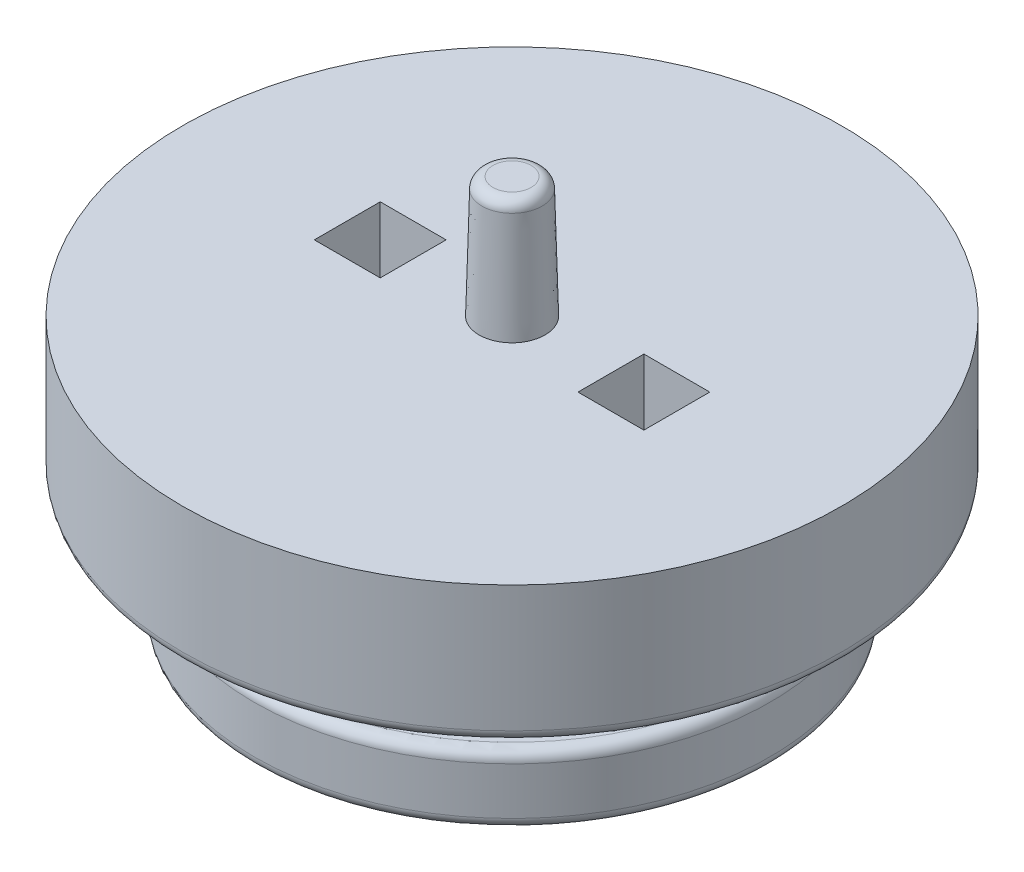
ISO-10303-21;
HEADER;
FILE_DESCRIPTION(('STEP AP214'),'2;1');
FILE_NAME('part.step','',(''),(''),'','','');
FILE_SCHEMA(('AUTOMOTIVE_DESIGN { 1 0 10303 214 1 1 1 1 }'));
ENDSEC;
DATA;
#1=APPLICATION_CONTEXT('core data for automotive mechanical design processes');
#2=APPLICATION_PROTOCOL_DEFINITION('international standard','automotive_design',2000,#1);
#3=PRODUCT_CONTEXT('',#1,'mechanical');
#4=PRODUCT('Part','Part','',(#3));
#5=PRODUCT_RELATED_PRODUCT_CATEGORY('part','',(#4));
#6=PRODUCT_DEFINITION_FORMATION('','',#4);
#7=PRODUCT_DEFINITION_CONTEXT('part definition',#1,'design');
#8=PRODUCT_DEFINITION('design','',#6,#7);
#9=PRODUCT_DEFINITION_SHAPE('','',#8);
#10=(LENGTH_UNIT() NAMED_UNIT(*) SI_UNIT(.MILLI.,.METRE.));
#11=(NAMED_UNIT(*) PLANE_ANGLE_UNIT() SI_UNIT($,.RADIAN.));
#12=(NAMED_UNIT(*) SI_UNIT($,.STERADIAN.) SOLID_ANGLE_UNIT());
#13=UNCERTAINTY_MEASURE_WITH_UNIT(LENGTH_MEASURE(1.E-05),#10,'distance_accuracy_value','');
#14=(GEOMETRIC_REPRESENTATION_CONTEXT(3) GLOBAL_UNCERTAINTY_ASSIGNED_CONTEXT((#13)) GLOBAL_UNIT_ASSIGNED_CONTEXT((#10,
#11,#12)) REPRESENTATION_CONTEXT('',''));
#15=CARTESIAN_POINT('',(0.,0.,0.));
#16=DIRECTION('',(0.,0.,1.));
#17=DIRECTION('',(1.,0.,0.));
#18=AXIS2_PLACEMENT_3D('',#15,#16,#17);
#19=CARTESIAN_POINT('',(0.,17.,0.));
#20=DIRECTION('',(0.,1.,0.));
#21=DIRECTION('',(0.,0.,1.));
#22=AXIS2_PLACEMENT_3D('',#19,#20,#21);
#23=PLANE('',#22);
#24=DIRECTION('',(0.,0.,-1.));
#25=VECTOR('',#24,1.);
#26=CARTESIAN_POINT('',(-4.5,17.,-1.5));
#27=LINE('',#26,#25);
#28=CARTESIAN_POINT('',(-4.5,17.,1.5));
#29=VERTEX_POINT('',#28);
#30=CARTESIAN_POINT('',(-4.5,17.,-1.5));
#31=VERTEX_POINT('',#30);
#32=EDGE_CURVE('E151',#29,#31,#27,.T.);
#33=ORIENTED_EDGE('',*,*,#32,.T.);
#34=DIRECTION('',(-1.,0.,0.));
#35=VECTOR('',#34,1.);
#36=CARTESIAN_POINT('',(-7.5,17.,-1.5));
#37=LINE('',#36,#35);
#38=CARTESIAN_POINT('',(-7.5,17.,-1.5));
#39=VERTEX_POINT('',#38);
#40=EDGE_CURVE('E169',#31,#39,#37,.T.);
#41=ORIENTED_EDGE('',*,*,#40,.T.);
#42=DIRECTION('',(0.,0.,1.));
#43=VECTOR('',#42,1.);
#44=CARTESIAN_POINT('',(-7.5,17.,-1.5));
#45=LINE('',#44,#43);
#46=CARTESIAN_POINT('',(-7.5,17.,1.5));
#47=VERTEX_POINT('',#46);
#48=EDGE_CURVE('E156',#39,#47,#45,.T.);
#49=ORIENTED_EDGE('',*,*,#48,.T.);
#50=DIRECTION('',(1.,0.,0.));
#51=VECTOR('',#50,1.);
#52=CARTESIAN_POINT('',(-7.5,17.,1.5));
#53=LINE('',#52,#51);
#54=EDGE_CURVE('E176',#47,#29,#53,.T.);
#55=ORIENTED_EDGE('',*,*,#54,.T.);
#56=EDGE_LOOP('',(#33,#41,#49,#55));
#57=FACE_BOUND('',#56,.T.);
#58=ADVANCED_FACE('F44',(#57),#23,.T.);
#59=DIRECTION('',(0.,0.,1.));
#60=VECTOR('',#59,1.);
#61=CARTESIAN_POINT('',(4.5,17.,-1.5));
#62=LINE('',#61,#60);
#63=CARTESIAN_POINT('',(4.5,17.,-1.5));
#64=VERTEX_POINT('',#63);
#65=CARTESIAN_POINT('',(4.5,17.,1.5));
#66=VERTEX_POINT('',#65);
#67=EDGE_CURVE('E128',#64,#66,#62,.T.);
#68=ORIENTED_EDGE('',*,*,#67,.T.);
#69=DIRECTION('',(1.,0.,0.));
#70=VECTOR('',#69,1.);
#71=CARTESIAN_POINT('',(4.5,17.,1.5));
#72=LINE('',#71,#70);
#73=CARTESIAN_POINT('',(7.5,17.,1.5));
#74=VERTEX_POINT('',#73);
#75=EDGE_CURVE('E112',#66,#74,#72,.T.);
#76=ORIENTED_EDGE('',*,*,#75,.T.);
#77=DIRECTION('',(0.,0.,-1.));
#78=VECTOR('',#77,1.);
#79=CARTESIAN_POINT('',(7.5,17.,-1.5));
#80=LINE('',#79,#78);
#81=CARTESIAN_POINT('',(7.5,17.,-1.5));
#82=VERTEX_POINT('',#81);
#83=EDGE_CURVE('E121',#74,#82,#80,.T.);
#84=ORIENTED_EDGE('',*,*,#83,.T.);
#85=DIRECTION('',(-1.,0.,0.));
#86=VECTOR('',#85,1.);
#87=CARTESIAN_POINT('',(4.5,17.,-1.5));
#88=LINE('',#87,#86);
#89=EDGE_CURVE('E181',#82,#64,#88,.T.);
#90=ORIENTED_EDGE('',*,*,#89,.T.);
#91=EDGE_LOOP('',(#68,#76,#84,#90));
#92=FACE_BOUND('',#91,.T.);
#93=ADVANCED_FACE('F132',(#92),#23,.T.);
#94=CARTESIAN_POINT('',(0.,21.25,0.));
#95=DIRECTION('',(0.,1.,0.));
#96=DIRECTION('',(0.,0.,1.));
#97=AXIS2_PLACEMENT_3D('',#94,#95,#96);
#98=PLANE('',#97);
#99=CARTESIAN_POINT('',(0.,21.25,0.));
#100=DIRECTION('',(0.,1.,0.));
#101=DIRECTION('',(0.,0.,1.));
#102=AXIS2_PLACEMENT_3D('',#99,#100,#101);
#103=CIRCLE('',#102,1.5);
#104=CARTESIAN_POINT('',(0.,21.25,1.5));
#105=VERTEX_POINT('',#104);
#106=EDGE_CURVE('E129',#105,#105,#103,.T.);
#107=ORIENTED_EDGE('',*,*,#106,.F.);
#108=EDGE_LOOP('',(#107));
#109=FACE_BOUND('',#108,.T.);
#110=CARTESIAN_POINT('',(0.,21.25,0.));
#111=DIRECTION('',(0.,1.,0.));
#112=DIRECTION('',(0.,0.,1.));
#113=AXIS2_PLACEMENT_3D('',#110,#111,#112);
#114=CIRCLE('',#113,15.);
#115=CARTESIAN_POINT('',(0.,21.25,15.));
#116=VERTEX_POINT('',#115);
#117=EDGE_CURVE('E194',#116,#116,#114,.T.);
#118=ORIENTED_EDGE('',*,*,#117,.T.);
#119=EDGE_LOOP('',(#118));
#120=FACE_BOUND('',#119,.T.);
#121=DIRECTION('',(-1.,0.,0.));
#122=VECTOR('',#121,1.);
#123=CARTESIAN_POINT('',(-7.5,21.25,-1.5));
#124=LINE('',#123,#122);
#125=CARTESIAN_POINT('',(-4.5,21.25,-1.5));
#126=VERTEX_POINT('',#125);
#127=CARTESIAN_POINT('',(-7.5,21.25,-1.5));
#128=VERTEX_POINT('',#127);
#129=EDGE_CURVE('E155',#126,#128,#124,.T.);
#130=ORIENTED_EDGE('',*,*,#129,.F.);
#131=DIRECTION('',(0.,0.,-1.));
#132=VECTOR('',#131,1.);
#133=CARTESIAN_POINT('',(-4.5,21.25,-1.5));
#134=LINE('',#133,#132);
#135=CARTESIAN_POINT('',(-4.5,21.25,1.5));
#136=VERTEX_POINT('',#135);
#137=EDGE_CURVE('E152',#136,#126,#134,.T.);
#138=ORIENTED_EDGE('',*,*,#137,.F.);
#139=DIRECTION('',(1.,0.,0.));
#140=VECTOR('',#139,1.);
#141=CARTESIAN_POINT('',(-7.5,21.25,1.5));
#142=LINE('',#141,#140);
#143=CARTESIAN_POINT('',(-7.5,21.25,1.5));
#144=VERTEX_POINT('',#143);
#145=EDGE_CURVE('E162',#144,#136,#142,.T.);
#146=ORIENTED_EDGE('',*,*,#145,.F.);
#147=DIRECTION('',(0.,0.,1.));
#148=VECTOR('',#147,1.);
#149=CARTESIAN_POINT('',(-7.5,21.25,-1.5));
#150=LINE('',#149,#148);
#151=EDGE_CURVE('E159',#128,#144,#150,.T.);
#152=ORIENTED_EDGE('',*,*,#151,.F.);
#153=EDGE_LOOP('',(#130,#138,#146,#152));
#154=FACE_BOUND('',#153,.T.);
#155=DIRECTION('',(-1.,0.,0.));
#156=VECTOR('',#155,1.);
#157=CARTESIAN_POINT('',(4.5,21.25,-1.5));
#158=LINE('',#157,#156);
#159=CARTESIAN_POINT('',(7.5,21.25,-1.5));
#160=VERTEX_POINT('',#159);
#161=CARTESIAN_POINT('',(4.5,21.25,-1.5));
#162=VERTEX_POINT('',#161);
#163=EDGE_CURVE('E139',#160,#162,#158,.T.);
#164=ORIENTED_EDGE('',*,*,#163,.F.);
#165=DIRECTION('',(0.,0.,-1.));
#166=VECTOR('',#165,1.);
#167=CARTESIAN_POINT('',(7.5,21.25,-1.5));
#168=LINE('',#167,#166);
#169=CARTESIAN_POINT('',(7.5,21.25,1.5));
#170=VERTEX_POINT('',#169);
#171=EDGE_CURVE('E135',#170,#160,#168,.T.);
#172=ORIENTED_EDGE('',*,*,#171,.F.);
#173=DIRECTION('',(1.,0.,0.));
#174=VECTOR('',#173,1.);
#175=CARTESIAN_POINT('',(4.5,21.25,1.5));
#176=LINE('',#175,#174);
#177=CARTESIAN_POINT('',(4.5,21.25,1.5));
#178=VERTEX_POINT('',#177);
#179=EDGE_CURVE('E114',#178,#170,#176,.T.);
#180=ORIENTED_EDGE('',*,*,#179,.F.);
#181=DIRECTION('',(0.,0.,1.));
#182=VECTOR('',#181,1.);
#183=CARTESIAN_POINT('',(4.5,21.25,-1.5));
#184=LINE('',#183,#182);
#185=EDGE_CURVE('E296',#162,#178,#184,.T.);
#186=ORIENTED_EDGE('',*,*,#185,.F.);
#187=EDGE_LOOP('',(#164,#172,#180,#186));
#188=FACE_BOUND('',#187,.T.);
#189=ADVANCED_FACE('F258',(#109,#120,#154,#188),#98,.T.);
#190=CARTESIAN_POINT('',(0.,21.25,0.));
#191=DIRECTION('',(0.,-1.,0.));
#192=DIRECTION('',(0.,0.,-1.));
#193=AXIS2_PLACEMENT_3D('',#190,#191,#192);
#194=CYLINDRICAL_SURFACE('',#193,15.);
#195=CARTESIAN_POINT('',(0.,15.5,0.));
#196=DIRECTION('',(0.,1.,0.));
#197=DIRECTION('',(0.,0.,1.));
#198=AXIS2_PLACEMENT_3D('',#195,#196,#197);
#199=CIRCLE('',#198,15.);
#200=CARTESIAN_POINT('',(0.,15.5,15.));
#201=VERTEX_POINT('',#200);
#202=EDGE_CURVE('E209',#201,#201,#199,.T.);
#203=ORIENTED_EDGE('',*,*,#202,.T.);
#204=EDGE_LOOP('',(#203));
#205=FACE_BOUND('',#204,.T.);
#206=ORIENTED_EDGE('',*,*,#117,.F.);
#207=EDGE_LOOP('',(#206));
#208=FACE_BOUND('',#207,.T.);
#209=ADVANCED_FACE('F261',(#205,#208),#194,.T.);
#210=CARTESIAN_POINT('',(-4.5,21.25,-1.5));
#211=DIRECTION('',(-1.,0.,0.));
#212=DIRECTION('',(0.,0.,1.));
#213=AXIS2_PLACEMENT_3D('',#210,#211,#212);
#214=PLANE('',#213);
#215=ORIENTED_EDGE('',*,*,#32,.F.);
#216=DIRECTION('',(0.,-1.,0.));
#217=VECTOR('',#216,1.);
#218=CARTESIAN_POINT('',(-4.5,21.25,1.5));
#219=LINE('',#218,#217);
#220=EDGE_CURVE('E165',#136,#29,#219,.T.);
#221=ORIENTED_EDGE('',*,*,#220,.F.);
#222=ORIENTED_EDGE('',*,*,#137,.T.);
#223=DIRECTION('',(0.,-1.,0.));
#224=VECTOR('',#223,1.);
#225=CARTESIAN_POINT('',(-4.5,21.25,-1.5));
#226=LINE('',#225,#224);
#227=EDGE_CURVE('E190',#126,#31,#226,.T.);
#228=ORIENTED_EDGE('',*,*,#227,.T.);
#229=EDGE_LOOP('',(#215,#221,#222,#228));
#230=FACE_BOUND('',#229,.T.);
#231=ADVANCED_FACE('F313',(#230),#214,.T.);
#232=CARTESIAN_POINT('',(-7.5,21.25,-1.5));
#233=DIRECTION('',(0.,0.,1.));
#234=DIRECTION('',(1.,0.,0.));
#235=AXIS2_PLACEMENT_3D('',#232,#233,#234);
#236=PLANE('',#235);
#237=ORIENTED_EDGE('',*,*,#40,.F.);
#238=ORIENTED_EDGE('',*,*,#227,.F.);
#239=ORIENTED_EDGE('',*,*,#129,.T.);
#240=DIRECTION('',(0.,-1.,0.));
#241=VECTOR('',#240,1.);
#242=CARTESIAN_POINT('',(-7.5,21.25,-1.5));
#243=LINE('',#242,#241);
#244=EDGE_CURVE('E187',#128,#39,#243,.T.);
#245=ORIENTED_EDGE('',*,*,#244,.T.);
#246=EDGE_LOOP('',(#237,#238,#239,#245));
#247=FACE_BOUND('',#246,.T.);
#248=ADVANCED_FACE('F319',(#247),#236,.T.);
#249=CARTESIAN_POINT('',(-7.5,21.25,-1.5));
#250=DIRECTION('',(1.,0.,0.));
#251=DIRECTION('',(0.,0.,-1.));
#252=AXIS2_PLACEMENT_3D('',#249,#250,#251);
#253=PLANE('',#252);
#254=ORIENTED_EDGE('',*,*,#48,.F.);
#255=ORIENTED_EDGE('',*,*,#244,.F.);
#256=ORIENTED_EDGE('',*,*,#151,.T.);
#257=DIRECTION('',(0.,-1.,0.));
#258=VECTOR('',#257,1.);
#259=CARTESIAN_POINT('',(-7.5,21.25,1.5));
#260=LINE('',#259,#258);
#261=EDGE_CURVE('E68',#144,#47,#260,.T.);
#262=ORIENTED_EDGE('',*,*,#261,.T.);
#263=EDGE_LOOP('',(#254,#255,#256,#262));
#264=FACE_BOUND('',#263,.T.);
#265=ADVANCED_FACE('F323',(#264),#253,.T.);
#266=CARTESIAN_POINT('',(-7.5,21.25,1.5));
#267=DIRECTION('',(0.,0.,-1.));
#268=DIRECTION('',(-1.,0.,0.));
#269=AXIS2_PLACEMENT_3D('',#266,#267,#268);
#270=PLANE('',#269);
#271=ORIENTED_EDGE('',*,*,#54,.F.);
#272=ORIENTED_EDGE('',*,*,#261,.F.);
#273=ORIENTED_EDGE('',*,*,#145,.T.);
#274=ORIENTED_EDGE('',*,*,#220,.T.);
#275=EDGE_LOOP('',(#271,#272,#273,#274));
#276=FACE_BOUND('',#275,.T.);
#277=ADVANCED_FACE('F327',(#276),#270,.T.);
#278=CARTESIAN_POINT('',(7.5,21.25,-1.5));
#279=DIRECTION('',(-1.,0.,0.));
#280=DIRECTION('',(0.,0.,1.));
#281=AXIS2_PLACEMENT_3D('',#278,#279,#280);
#282=PLANE('',#281);
#283=ORIENTED_EDGE('',*,*,#83,.F.);
#284=DIRECTION('',(0.,-1.,0.));
#285=VECTOR('',#284,1.);
#286=CARTESIAN_POINT('',(7.5,21.25,1.5));
#287=LINE('',#286,#285);
#288=EDGE_CURVE('E108',#170,#74,#287,.T.);
#289=ORIENTED_EDGE('',*,*,#288,.F.);
#290=ORIENTED_EDGE('',*,*,#171,.T.);
#291=DIRECTION('',(0.,-1.,0.));
#292=VECTOR('',#291,1.);
#293=CARTESIAN_POINT('',(7.5,21.25,-1.5));
#294=LINE('',#293,#292);
#295=EDGE_CURVE('E124',#160,#82,#294,.T.);
#296=ORIENTED_EDGE('',*,*,#295,.T.);
#297=EDGE_LOOP('',(#283,#289,#290,#296));
#298=FACE_BOUND('',#297,.T.);
#299=ADVANCED_FACE('F122',(#298),#282,.T.);
#300=CARTESIAN_POINT('',(4.5,21.25,-1.5));
#301=DIRECTION('',(0.,0.,1.));
#302=DIRECTION('',(1.,0.,0.));
#303=AXIS2_PLACEMENT_3D('',#300,#301,#302);
#304=PLANE('',#303);
#305=ORIENTED_EDGE('',*,*,#89,.F.);
#306=ORIENTED_EDGE('',*,*,#295,.F.);
#307=ORIENTED_EDGE('',*,*,#163,.T.);
#308=DIRECTION('',(0.,-1.,0.));
#309=VECTOR('',#308,1.);
#310=CARTESIAN_POINT('',(4.5,21.25,-1.5));
#311=LINE('',#310,#309);
#312=EDGE_CURVE('E146',#162,#64,#311,.T.);
#313=ORIENTED_EDGE('',*,*,#312,.T.);
#314=EDGE_LOOP('',(#305,#306,#307,#313));
#315=FACE_BOUND('',#314,.T.);
#316=ADVANCED_FACE('F302',(#315),#304,.T.);
#317=CARTESIAN_POINT('',(4.5,21.25,-1.5));
#318=DIRECTION('',(1.,0.,0.));
#319=DIRECTION('',(0.,0.,-1.));
#320=AXIS2_PLACEMENT_3D('',#317,#318,#319);
#321=PLANE('',#320);
#322=ORIENTED_EDGE('',*,*,#67,.F.);
#323=ORIENTED_EDGE('',*,*,#312,.F.);
#324=ORIENTED_EDGE('',*,*,#185,.T.);
#325=DIRECTION('',(0.,-1.,0.));
#326=VECTOR('',#325,1.);
#327=CARTESIAN_POINT('',(4.5,21.25,1.5));
#328=LINE('',#327,#326);
#329=EDGE_CURVE('E60',#178,#66,#328,.T.);
#330=ORIENTED_EDGE('',*,*,#329,.T.);
#331=EDGE_LOOP('',(#322,#323,#324,#330));
#332=FACE_BOUND('',#331,.T.);
#333=ADVANCED_FACE('F307',(#332),#321,.T.);
#334=CARTESIAN_POINT('',(4.5,21.25,1.5));
#335=DIRECTION('',(0.,0.,-1.));
#336=DIRECTION('',(-1.,0.,0.));
#337=AXIS2_PLACEMENT_3D('',#334,#335,#336);
#338=PLANE('',#337);
#339=ORIENTED_EDGE('',*,*,#75,.F.);
#340=ORIENTED_EDGE('',*,*,#329,.F.);
#341=ORIENTED_EDGE('',*,*,#179,.T.);
#342=ORIENTED_EDGE('',*,*,#288,.T.);
#343=EDGE_LOOP('',(#339,#340,#341,#342));
#344=FACE_BOUND('',#343,.T.);
#345=ADVANCED_FACE('F110',(#344),#338,.T.);
#346=CARTESIAN_POINT('',(0.,21.25,0.));
#347=DIRECTION('',(0.,-1.,0.));
#348=DIRECTION('',(0.,0.,1.));
#349=AXIS2_PLACEMENT_3D('',#346,#347,#348);
#350=CONICAL_SURFACE('',#349,1.5,0.026179938779915);
#351=CARTESIAN_POINT('',(0.,26.2630884741539,0.));
#352=DIRECTION('',(0.,-1.,0.));
#353=DIRECTION('',(0.,0.,-1.));
#354=AXIS2_PLACEMENT_3D('',#351,#352,#353);
#355=CIRCLE('',#354,1.36872765839641);
#356=CARTESIAN_POINT('',(0.,26.2630884741539,-1.36872765839641));
#357=VERTEX_POINT('',#356);
#358=EDGE_CURVE('E201',#357,#357,#355,.T.);
#359=ORIENTED_EDGE('',*,*,#358,.T.);
#360=EDGE_LOOP('',(#359));
#361=FACE_BOUND('',#360,.T.);
#362=ORIENTED_EDGE('',*,*,#106,.T.);
#363=EDGE_LOOP('',(#362));
#364=FACE_BOUND('',#363,.T.);
#365=ADVANCED_FACE('F278',(#361,#364),#350,.T.);
#366=CARTESIAN_POINT('',(0.,26.75,0.));
#367=DIRECTION('',(0.,1.,0.));
#368=DIRECTION('',(0.,0.,1.));
#369=AXIS2_PLACEMENT_3D('',#366,#367,#368);
#370=PLANE('',#369);
#371=CARTESIAN_POINT('',(0.,26.75,0.));
#372=DIRECTION('',(0.,1.,0.));
#373=DIRECTION('',(0.,0.,1.));
#374=AXIS2_PLACEMENT_3D('',#371,#372,#373);
#375=CIRCLE('',#374,0.868898995908631);
#376=CARTESIAN_POINT('',(0.,26.75,0.868898995908631));
#377=VERTEX_POINT('',#376);
#378=EDGE_CURVE('E180',#377,#377,#375,.T.);
#379=ORIENTED_EDGE('',*,*,#378,.T.);
#380=EDGE_LOOP('',(#379));
#381=FACE_BOUND('',#380,.T.);
#382=ADVANCED_FACE('F270',(#381),#370,.T.);
#383=CARTESIAN_POINT('',(0.,26.25,0.));
#384=DIRECTION('',(0.,1.,0.));
#385=DIRECTION('',(0.,0.,1.));
#386=AXIS2_PLACEMENT_3D('',#383,#384,#385);
#387=TOROIDAL_SURFACE('',#386,0.868898995908631,0.5);
#388=ORIENTED_EDGE('',*,*,#358,.F.);
#389=EDGE_LOOP('',(#388));
#390=FACE_BOUND('',#389,.T.);
#391=ORIENTED_EDGE('',*,*,#378,.F.);
#392=EDGE_LOOP('',(#391));
#393=FACE_BOUND('',#392,.T.);
#394=ADVANCED_FACE('F268',(#390,#393),#387,.T.);
#395=CARTESIAN_POINT('',(0.,15.,0.));
#396=DIRECTION('',(0.,1.,0.));
#397=DIRECTION('',(0.,0.,1.));
#398=AXIS2_PLACEMENT_3D('',#395,#396,#397);
#399=PLANE('',#398);
#400=CARTESIAN_POINT('',(0.,15.,0.));
#401=DIRECTION('',(0.,1.,0.));
#402=DIRECTION('',(0.,0.,1.));
#403=AXIS2_PLACEMENT_3D('',#400,#401,#402);
#404=CIRCLE('',#403,14.5);
#405=CARTESIAN_POINT('',(0.,15.,14.5));
#406=VERTEX_POINT('',#405);
#407=EDGE_CURVE('E217',#406,#406,#404,.F.);
#408=ORIENTED_EDGE('',*,*,#407,.T.);
#409=EDGE_LOOP('',(#408));
#410=FACE_BOUND('',#409,.T.);
#411=CARTESIAN_POINT('',(0.,15.,0.));
#412=DIRECTION('',(0.,1.,0.));
#413=DIRECTION('',(0.,0.,1.));
#414=AXIS2_PLACEMENT_3D('',#411,#412,#413);
#415=CIRCLE('',#414,5.75);
#416=CARTESIAN_POINT('',(0.,15.,5.75));
#417=VERTEX_POINT('',#416);
#418=EDGE_CURVE('E205',#417,#417,#415,.T.);
#419=ORIENTED_EDGE('',*,*,#418,.T.);
#420=EDGE_LOOP('',(#419));
#421=FACE_BOUND('',#420,.T.);
#422=ADVANCED_FACE('F266',(#410,#421),#399,.F.);
#423=CARTESIAN_POINT('',(0.,15.,0.));
#424=DIRECTION('',(0.,-1.,0.));
#425=DIRECTION('',(0.,0.,-1.));
#426=AXIS2_PLACEMENT_3D('',#423,#424,#425);
#427=CYLINDRICAL_SURFACE('',#426,5.75);
#428=CARTESIAN_POINT('',(0.,12.4,0.));
#429=DIRECTION('',(0.,1.,0.));
#430=DIRECTION('',(0.,0.,1.));
#431=AXIS2_PLACEMENT_3D('',#428,#429,#430);
#432=CIRCLE('',#431,5.75);
#433=CARTESIAN_POINT('',(0.,12.4,5.75));
#434=VERTEX_POINT('',#433);
#435=EDGE_CURVE('E210',#434,#434,#432,.T.);
#436=ORIENTED_EDGE('',*,*,#435,.T.);
#437=EDGE_LOOP('',(#436));
#438=FACE_BOUND('',#437,.T.);
#439=ORIENTED_EDGE('',*,*,#418,.F.);
#440=EDGE_LOOP('',(#439));
#441=FACE_BOUND('',#440,.T.);
#442=ADVANCED_FACE('F263',(#438,#441),#427,.T.);
#443=CARTESIAN_POINT('',(0.,12.4,0.));
#444=DIRECTION('',(0.,1.,0.));
#445=DIRECTION('',(0.,0.,1.));
#446=AXIS2_PLACEMENT_3D('',#443,#444,#445);
#447=PLANE('',#446);
#448=CARTESIAN_POINT('',(0.,12.4,0.));
#449=DIRECTION('',(0.,1.,0.));
#450=DIRECTION('',(0.,0.,1.));
#451=AXIS2_PLACEMENT_3D('',#448,#449,#450);
#452=CIRCLE('',#451,11.25);
#453=CARTESIAN_POINT('',(0.,12.4,11.25));
#454=VERTEX_POINT('',#453);
#455=EDGE_CURVE('E13',#454,#454,#452,.T.);
#456=ORIENTED_EDGE('',*,*,#455,.T.);
#457=EDGE_LOOP('',(#456));
#458=FACE_BOUND('',#457,.T.);
#459=ORIENTED_EDGE('',*,*,#435,.F.);
#460=EDGE_LOOP('',(#459));
#461=FACE_BOUND('',#460,.T.);
#462=ADVANCED_FACE('F250',(#458,#461),#447,.T.);
#463=CARTESIAN_POINT('',(0.,48.2340187157677,0.));
#464=DIRECTION('',(0.,-1.,0.));
#465=DIRECTION('',(0.,0.,-1.));
#466=AXIS2_PLACEMENT_3D('',#463,#464,#465);
#467=CYLINDRICAL_SURFACE('',#466,11.75);
#468=CARTESIAN_POINT('',(0.,9.75,0.));
#469=DIRECTION('',(0.,1.,0.));
#470=DIRECTION('',(0.,0.,1.));
#471=AXIS2_PLACEMENT_3D('',#468,#469,#470);
#472=CIRCLE('',#471,11.75);
#473=CARTESIAN_POINT('',(0.,9.74999999999999,-11.75));
#474=VERTEX_POINT('',#473);
#475=EDGE_CURVE('E53',#474,#474,#472,.T.);
#476=CARTESIAN_POINT('',(0.,11.9,0.));
#477=DIRECTION('',(0.,1.,0.));
#478=DIRECTION('',(0.,0.,1.));
#479=AXIS2_PLACEMENT_3D('',#476,#477,#478);
#480=CIRCLE('',#479,11.75);
#481=CARTESIAN_POINT('',(0.,11.9,-11.75));
#482=VERTEX_POINT('',#481);
#483=EDGE_CURVE('E225',#482,#482,#480,.F.);
#484=CARTESIAN_POINT('',(0.,9.74999999999999,-11.75));
#485=CARTESIAN_POINT('',(0.,9.77239583333333,-11.75));
#486=CARTESIAN_POINT('',(0.,9.79479166666666,-11.75));
#487=CARTESIAN_POINT('',(0.,9.83958333333333,-11.75));
#488=CARTESIAN_POINT('',(0.,9.86197916666666,-11.75));
#489=CARTESIAN_POINT('',(0.,9.90677083333333,-11.75));
#490=CARTESIAN_POINT('',(0.,9.92916666666666,-11.75));
#491=CARTESIAN_POINT('',(0.,9.97395833333333,-11.75));
#492=CARTESIAN_POINT('',(0.,9.99635416666666,-11.75));
#493=CARTESIAN_POINT('',(0.,10.0411458333333,-11.75));
#494=CARTESIAN_POINT('',(0.,10.0635416666667,-11.75));
#495=CARTESIAN_POINT('',(0.,10.1083333333333,-11.75));
#496=CARTESIAN_POINT('',(0.,10.1307291666667,-11.75));
#497=CARTESIAN_POINT('',(0.,10.1755208333333,-11.75));
#498=CARTESIAN_POINT('',(0.,10.1979166666667,-11.75));
#499=CARTESIAN_POINT('',(0.,10.2427083333333,-11.75));
#500=CARTESIAN_POINT('',(0.,10.2651041666667,-11.75));
#501=CARTESIAN_POINT('',(0.,10.3098958333333,-11.75));
#502=CARTESIAN_POINT('',(0.,10.3322916666667,-11.75));
#503=CARTESIAN_POINT('',(0.,10.3770833333333,-11.75));
#504=CARTESIAN_POINT('',(0.,10.3994791666667,-11.75));
#505=CARTESIAN_POINT('',(0.,10.4442708333333,-11.75));
#506=CARTESIAN_POINT('',(0.,10.4666666666667,-11.75));
#507=CARTESIAN_POINT('',(0.,10.5114583333333,-11.75));
#508=CARTESIAN_POINT('',(0.,10.5338541666667,-11.75));
#509=CARTESIAN_POINT('',(0.,10.5786458333333,-11.75));
#510=CARTESIAN_POINT('',(0.,10.6010416666667,-11.75));
#511=CARTESIAN_POINT('',(0.,10.6458333333333,-11.75));
#512=CARTESIAN_POINT('',(0.,10.6682291666667,-11.75));
#513=CARTESIAN_POINT('',(0.,10.7130208333333,-11.75));
#514=CARTESIAN_POINT('',(0.,10.7354166666667,-11.75));
#515=CARTESIAN_POINT('',(0.,10.7802083333333,-11.75));
#516=CARTESIAN_POINT('',(0.,10.8026041666667,-11.75));
#517=CARTESIAN_POINT('',(0.,10.8473958333333,-11.75));
#518=CARTESIAN_POINT('',(0.,10.8697916666667,-11.75));
#519=CARTESIAN_POINT('',(0.,10.9145833333333,-11.75));
#520=CARTESIAN_POINT('',(0.,10.9369791666667,-11.75));
#521=CARTESIAN_POINT('',(0.,10.9817708333333,-11.75));
#522=CARTESIAN_POINT('',(0.,11.0041666666667,-11.75));
#523=CARTESIAN_POINT('',(0.,11.0489583333333,-11.75));
#524=CARTESIAN_POINT('',(0.,11.0713541666667,-11.75));
#525=CARTESIAN_POINT('',(0.,11.1161458333333,-11.75));
#526=CARTESIAN_POINT('',(0.,11.1385416666667,-11.75));
#527=CARTESIAN_POINT('',(0.,11.1833333333333,-11.75));
#528=CARTESIAN_POINT('',(0.,11.2057291666667,-11.75));
#529=CARTESIAN_POINT('',(0.,11.2505208333333,-11.75));
#530=CARTESIAN_POINT('',(0.,11.2729166666667,-11.75));
#531=CARTESIAN_POINT('',(0.,11.3177083333333,-11.75));
#532=CARTESIAN_POINT('',(0.,11.3401041666667,-11.75));
#533=CARTESIAN_POINT('',(0.,11.3848958333333,-11.75));
#534=CARTESIAN_POINT('',(0.,11.4072916666667,-11.75));
#535=CARTESIAN_POINT('',(0.,11.4520833333333,-11.75));
#536=CARTESIAN_POINT('',(0.,11.4744791666667,-11.75));
#537=CARTESIAN_POINT('',(0.,11.5192708333333,-11.75));
#538=CARTESIAN_POINT('',(0.,11.5416666666667,-11.75));
#539=CARTESIAN_POINT('',(0.,11.5864583333333,-11.75));
#540=CARTESIAN_POINT('',(0.,11.6088541666667,-11.75));
#541=CARTESIAN_POINT('',(0.,11.6536458333333,-11.75));
#542=CARTESIAN_POINT('',(0.,11.6760416666667,-11.75));
#543=CARTESIAN_POINT('',(0.,11.7208333333333,-11.75));
#544=CARTESIAN_POINT('',(0.,11.7432291666667,-11.75));
#545=CARTESIAN_POINT('',(0.,11.7880208333333,-11.75));
#546=CARTESIAN_POINT('',(0.,11.8104166666667,-11.75));
#547=CARTESIAN_POINT('',(0.,11.8552083333333,-11.75));
#548=CARTESIAN_POINT('',(0.,11.8776041666667,-11.75));
#549=CARTESIAN_POINT('',(0.,11.9,-11.75));
#550=B_SPLINE_CURVE_WITH_KNOTS('',3,(#484,#485,#486,#487,#488,#489,#490,#491,#492,#493,#494,
#495,#496,#497,#498,#499,#500,#501,#502,#503,#504,#505,#506,#507,#508,#509,#510,#511,#512,#513,
#514,#515,#516,#517,#518,#519,#520,#521,#522,#523,#524,#525,#526,#527,#528,#529,#530,#531,#532,
#533,#534,#535,#536,#537,#538,#539,#540,#541,#542,#543,#544,#545,#546,#547,#548,#549),
.UNSPECIFIED.,.F.,.F.,(4,2,2,2,2,2,2,2,2,2,2,2,2,2,2,2,2,2,2,2,2,2,2,2,2,2,2,2,2,2,2,2,4),(0.,
0.067187500000003,0.134374999999999,0.201562500000002,0.268749999999998,0.335937500000001,
0.403124999999997,0.4703125,0.537499999999996,0.604687499999999,0.671875000000002,
0.739062499999998,0.806250000000001,0.873437499999997,0.940625,1.0078125,1.075,1.1421875,
1.209375,1.2765625,1.34375,1.4109375,1.478125,1.5453125,1.6125,1.6796875,1.746875,1.8140625,
1.88125,1.9484375,2.015625,2.0828125,2.15),.UNSPECIFIED.);
#551=EDGE_CURVE('BSEAM232',#474,#482,#550,.T.);
#552=ORIENTED_EDGE('',*,*,#475,.T.);
#553=ORIENTED_EDGE('',*,*,#483,.T.);
#554=ORIENTED_EDGE('',*,*,#551,.T.);
#555=ORIENTED_EDGE('',*,*,#551,.F.);
#556=EDGE_LOOP('',(#552,#554,#553,#555));
#557=FACE_BOUND('',#556,.T.);
#558=ADVANCED_FACE('F232',(#557),#467,.T.);
#559=CARTESIAN_POINT('',(0.,9.25,0.));
#560=DIRECTION('',(0.,1.,0.));
#561=DIRECTION('',(0.,0.,1.));
#562=AXIS2_PLACEMENT_3D('',#559,#560,#561);
#563=PLANE('',#562);
#564=CARTESIAN_POINT('',(0.,9.25,0.));
#565=DIRECTION('',(0.,1.,0.));
#566=DIRECTION('',(0.,0.,1.));
#567=AXIS2_PLACEMENT_3D('',#564,#565,#566);
#568=CIRCLE('',#567,11.25);
#569=CARTESIAN_POINT('',(0.,9.25,11.25));
#570=VERTEX_POINT('',#569);
#571=EDGE_CURVE('E221',#570,#570,#568,.F.);
#572=ORIENTED_EDGE('',*,*,#571,.T.);
#573=EDGE_LOOP('',(#572));
#574=FACE_BOUND('',#573,.T.);
#575=ADVANCED_FACE('F241',(#574),#563,.F.);
#576=CARTESIAN_POINT('',(0.,15.5,0.));
#577=DIRECTION('',(0.,1.,0.));
#578=DIRECTION('',(0.,0.,1.));
#579=AXIS2_PLACEMENT_3D('',#576,#577,#578);
#580=TOROIDAL_SURFACE('',#579,14.5,0.5);
#581=ORIENTED_EDGE('',*,*,#407,.F.);
#582=EDGE_LOOP('',(#581));
#583=FACE_BOUND('',#582,.T.);
#584=ORIENTED_EDGE('',*,*,#202,.F.);
#585=EDGE_LOOP('',(#584));
#586=FACE_BOUND('',#585,.T.);
#587=ADVANCED_FACE('F238',(#583,#586),#580,.T.);
#588=CARTESIAN_POINT('',(0.,9.75,0.));
#589=DIRECTION('',(0.,1.,0.));
#590=DIRECTION('',(0.,0.,1.));
#591=AXIS2_PLACEMENT_3D('',#588,#589,#590);
#592=TOROIDAL_SURFACE('',#591,11.25,0.5);
#593=ORIENTED_EDGE('',*,*,#475,.F.);
#594=EDGE_LOOP('',(#593));
#595=FACE_BOUND('',#594,.T.);
#596=ORIENTED_EDGE('',*,*,#571,.F.);
#597=EDGE_LOOP('',(#596));
#598=FACE_BOUND('',#597,.T.);
#599=ADVANCED_FACE('F235',(#595,#598),#592,.T.);
#600=CARTESIAN_POINT('',(0.,11.9,0.));
#601=DIRECTION('',(0.,1.,0.));
#602=DIRECTION('',(0.,0.,1.));
#603=AXIS2_PLACEMENT_3D('',#600,#601,#602);
#604=TOROIDAL_SURFACE('',#603,11.25,0.5);
#605=ORIENTED_EDGE('',*,*,#455,.F.);
#606=EDGE_LOOP('',(#605));
#607=FACE_BOUND('',#606,.T.);
#608=ORIENTED_EDGE('',*,*,#483,.F.);
#609=EDGE_LOOP('',(#608));
#610=FACE_BOUND('',#609,.T.);
#611=ADVANCED_FACE('F46',(#607,#610),#604,.T.);
#612=CLOSED_SHELL('',(#58,#93,#189,#209,#231,#248,#265,#277,#299,#316,#333,#345,#365,#382,#394,
#422,#442,#462,#558,#575,#587,#599,#611));
#613=MANIFOLD_SOLID_BREP('B2',#612);
#614=ADVANCED_BREP_SHAPE_REPRESENTATION('',(#18,#613),#14);
#615=SHAPE_DEFINITION_REPRESENTATION(#9,#614);
ENDSEC;
END-ISO-10303-21;
